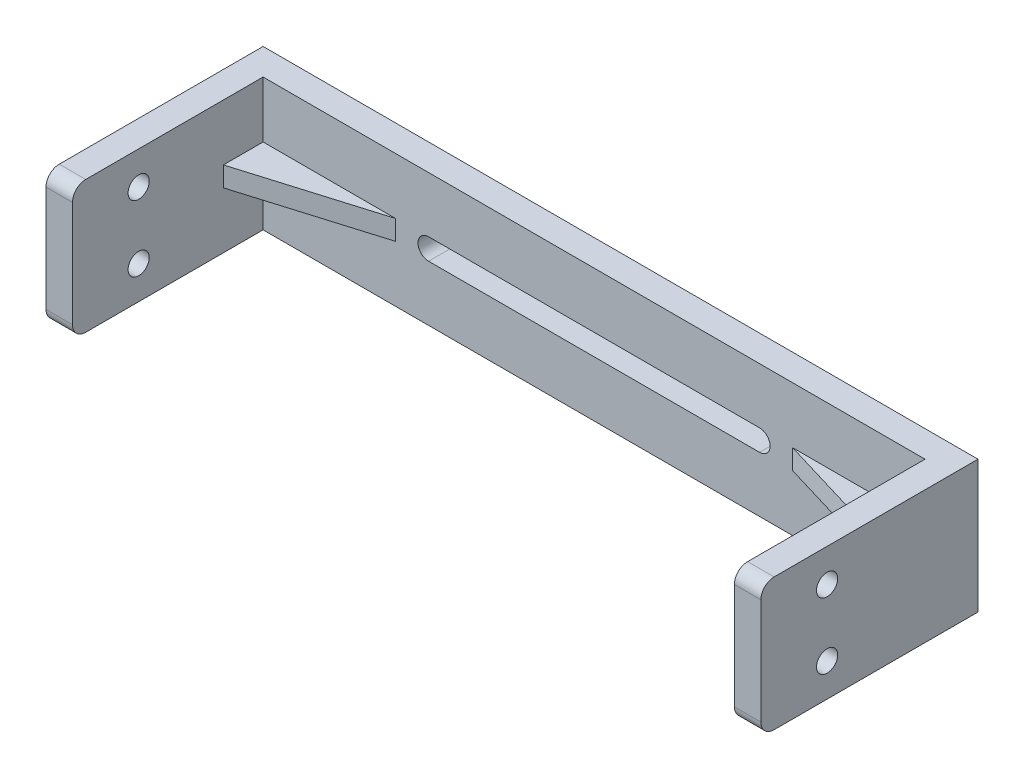
ISO-10303-21;
HEADER;
FILE_DESCRIPTION(('STEP AP214'),'2;1');
FILE_NAME('part.step','',(''),(''),'','','');
FILE_SCHEMA(('AUTOMOTIVE_DESIGN { 1 0 10303 214 1 1 1 1 }'));
ENDSEC;
DATA;
#1=APPLICATION_CONTEXT('core data for automotive mechanical design processes');
#2=APPLICATION_PROTOCOL_DEFINITION('international standard','automotive_design',2000,#1);
#3=PRODUCT_CONTEXT('',#1,'mechanical');
#4=PRODUCT('Part','Part','',(#3));
#5=PRODUCT_RELATED_PRODUCT_CATEGORY('part','',(#4));
#6=PRODUCT_DEFINITION_FORMATION('','',#4);
#7=PRODUCT_DEFINITION_CONTEXT('part definition',#1,'design');
#8=PRODUCT_DEFINITION('design','',#6,#7);
#9=PRODUCT_DEFINITION_SHAPE('','',#8);
#10=(LENGTH_UNIT() NAMED_UNIT(*) SI_UNIT(.MILLI.,.METRE.));
#11=(NAMED_UNIT(*) PLANE_ANGLE_UNIT() SI_UNIT($,.RADIAN.));
#12=(NAMED_UNIT(*) SI_UNIT($,.STERADIAN.) SOLID_ANGLE_UNIT());
#13=UNCERTAINTY_MEASURE_WITH_UNIT(LENGTH_MEASURE(1.E-05),#10,'distance_accuracy_value','');
#14=(GEOMETRIC_REPRESENTATION_CONTEXT(3) GLOBAL_UNCERTAINTY_ASSIGNED_CONTEXT((#13)) GLOBAL_UNIT_ASSIGNED_CONTEXT((#10,
#11,#12)) REPRESENTATION_CONTEXT('',''));
#15=CARTESIAN_POINT('',(0.,0.,0.));
#16=DIRECTION('',(0.,0.,1.));
#17=DIRECTION('',(1.,0.,0.));
#18=AXIS2_PLACEMENT_3D('',#15,#16,#17);
#19=CARTESIAN_POINT('',(-60.002,64.0000000000004,-114.3));
#20=DIRECTION('',(0.,0.,-1.));
#21=DIRECTION('',(-1.,0.,0.));
#22=AXIS2_PLACEMENT_3D('',#19,#20,#21);
#23=PLANE('',#22);
#24=DIRECTION('',(1.,0.,0.));
#25=VECTOR('',#24,1.);
#26=CARTESIAN_POINT('',(40.,52.4000000000004,-114.3));
#27=LINE('',#26,#25);
#28=CARTESIAN_POINT('',(-10.,52.4000000000004,-114.3));
#29=VERTEX_POINT('',#28);
#30=CARTESIAN_POINT('',(40.,52.4000000000004,-114.3));
#31=VERTEX_POINT('',#30);
#32=EDGE_CURVE('E293',#29,#31,#27,.T.);
#33=ORIENTED_EDGE('',*,*,#32,.F.);
#34=CARTESIAN_POINT('',(-10.,54.0000000000004,-114.3));
#35=DIRECTION('',(0.,0.,-1.));
#36=DIRECTION('',(-1.,0.,0.));
#37=AXIS2_PLACEMENT_3D('',#34,#35,#36);
#38=CIRCLE('',#37,1.60000000000001);
#39=CARTESIAN_POINT('',(-10.,55.6000000000005,-114.3));
#40=VERTEX_POINT('',#39);
#41=EDGE_CURVE('E296',#40,#29,#38,.F.);
#42=ORIENTED_EDGE('',*,*,#41,.F.);
#43=DIRECTION('',(-1.,0.,0.));
#44=VECTOR('',#43,1.);
#45=CARTESIAN_POINT('',(-9.99999999999999,55.6000000000005,-114.3));
#46=LINE('',#45,#44);
#47=CARTESIAN_POINT('',(40.,55.6000000000005,-114.3));
#48=VERTEX_POINT('',#47);
#49=EDGE_CURVE('E218',#48,#40,#46,.T.);
#50=ORIENTED_EDGE('',*,*,#49,.F.);
#51=CARTESIAN_POINT('',(40.,54.0000000000004,-114.3));
#52=DIRECTION('',(0.,0.,-1.));
#53=DIRECTION('',(-1.,0.,0.));
#54=AXIS2_PLACEMENT_3D('',#51,#52,#53);
#55=CIRCLE('',#54,1.60000000000002);
#56=EDGE_CURVE('E290',#31,#48,#55,.F.);
#57=ORIENTED_EDGE('',*,*,#56,.F.);
#58=EDGE_LOOP('',(#33,#42,#50,#57));
#59=FACE_BOUND('',#58,.T.);
#60=DIRECTION('',(1.,0.,0.));
#61=VECTOR('',#60,1.);
#62=CARTESIAN_POINT('',(45.,55.5000000000004,-114.3));
#63=LINE('',#62,#61);
#64=CARTESIAN_POINT('',(45.,55.5000000000004,-114.3));
#65=VERTEX_POINT('',#64);
#66=CARTESIAN_POINT('',(65.,55.5000000000004,-114.3));
#67=VERTEX_POINT('',#66);
#68=EDGE_CURVE('E193',#65,#67,#63,.T.);
#69=ORIENTED_EDGE('',*,*,#68,.T.);
#70=DIRECTION('',(0.,1.,0.));
#71=VECTOR('',#70,1.);
#72=CARTESIAN_POINT('',(65.,64.0000000000004,-114.3));
#73=LINE('',#72,#71);
#74=CARTESIAN_POINT('',(65.,64.0000000000004,-114.3));
#75=VERTEX_POINT('',#74);
#76=EDGE_CURVE('E204',#67,#75,#73,.T.);
#77=ORIENTED_EDGE('',*,*,#76,.T.);
#78=DIRECTION('',(1.,0.,0.));
#79=VECTOR('',#78,1.);
#80=CARTESIAN_POINT('',(-60.002,64.0000000000004,-114.3));
#81=LINE('',#80,#79);
#82=CARTESIAN_POINT('',(-35.,64.0000000000004,-114.3));
#83=VERTEX_POINT('',#82);
#84=EDGE_CURVE('E262',#83,#75,#81,.T.);
#85=ORIENTED_EDGE('',*,*,#84,.F.);
#86=DIRECTION('',(0.,1.,0.));
#87=VECTOR('',#86,1.);
#88=CARTESIAN_POINT('',(-35.,64.0000000000004,-114.3));
#89=LINE('',#88,#87);
#90=CARTESIAN_POINT('',(-35.,55.5000000000004,-114.3));
#91=VERTEX_POINT('',#90);
#92=EDGE_CURVE('E309',#91,#83,#89,.T.);
#93=ORIENTED_EDGE('',*,*,#92,.F.);
#94=DIRECTION('',(-1.,0.,0.));
#95=VECTOR('',#94,1.);
#96=CARTESIAN_POINT('',(-15.,55.5000000000004,-114.3));
#97=LINE('',#96,#95);
#98=CARTESIAN_POINT('',(-15.,55.5000000000004,-114.3));
#99=VERTEX_POINT('',#98);
#100=EDGE_CURVE('E322',#99,#91,#97,.T.);
#101=ORIENTED_EDGE('',*,*,#100,.F.);
#102=DIRECTION('',(0.,-1.,0.));
#103=VECTOR('',#102,1.);
#104=CARTESIAN_POINT('',(-15.,55.5000000000004,-114.3));
#105=LINE('',#104,#103);
#106=CARTESIAN_POINT('',(-15.,52.5000000000004,-114.3));
#107=VERTEX_POINT('',#106);
#108=EDGE_CURVE('E338',#99,#107,#105,.T.);
#109=ORIENTED_EDGE('',*,*,#108,.T.);
#110=DIRECTION('',(-1.,0.,0.));
#111=VECTOR('',#110,1.);
#112=CARTESIAN_POINT('',(-15.,52.5000000000004,-114.3));
#113=LINE('',#112,#111);
#114=CARTESIAN_POINT('',(-35.,52.5000000000004,-114.3));
#115=VERTEX_POINT('',#114);
#116=EDGE_CURVE('E328',#107,#115,#113,.T.);
#117=ORIENTED_EDGE('',*,*,#116,.T.);
#118=CARTESIAN_POINT('',(-35.,44.0000000000004,-114.3));
#119=VERTEX_POINT('',#118);
#120=EDGE_CURVE('E314',#119,#115,#89,.T.);
#121=ORIENTED_EDGE('',*,*,#120,.F.);
#122=DIRECTION('',(1.,0.,0.));
#123=VECTOR('',#122,1.);
#124=CARTESIAN_POINT('',(-60.002,44.0000000000004,-114.3));
#125=LINE('',#124,#123);
#126=CARTESIAN_POINT('',(65.,44.0000000000004,-114.3));
#127=VERTEX_POINT('',#126);
#128=EDGE_CURVE('E213',#119,#127,#125,.T.);
#129=ORIENTED_EDGE('',*,*,#128,.T.);
#130=CARTESIAN_POINT('',(65.,52.5000000000004,-114.3));
#131=VERTEX_POINT('',#130);
#132=EDGE_CURVE('E212',#127,#131,#73,.T.);
#133=ORIENTED_EDGE('',*,*,#132,.T.);
#134=DIRECTION('',(1.,0.,0.));
#135=VECTOR('',#134,1.);
#136=CARTESIAN_POINT('',(45.,52.5000000000004,-114.3));
#137=LINE('',#136,#135);
#138=CARTESIAN_POINT('',(45.,52.5000000000004,-114.3));
#139=VERTEX_POINT('',#138);
#140=EDGE_CURVE('E56',#139,#131,#137,.T.);
#141=ORIENTED_EDGE('',*,*,#140,.F.);
#142=DIRECTION('',(0.,-1.,0.));
#143=VECTOR('',#142,1.);
#144=CARTESIAN_POINT('',(45.,55.5000000000004,-114.3));
#145=LINE('',#144,#143);
#146=EDGE_CURVE('E206',#65,#139,#145,.T.);
#147=ORIENTED_EDGE('',*,*,#146,.F.);
#148=EDGE_LOOP('',(#69,#77,#85,#93,#101,#109,#117,#121,#129,#133,#141,#147));
#149=FACE_BOUND('',#148,.T.);
#150=ADVANCED_FACE('F41',(#59,#149),#23,.F.);
#151=CARTESIAN_POINT('',(65.,0.,0.));
#152=DIRECTION('',(1.,0.,0.));
#153=DIRECTION('',(0.,0.,1.));
#154=AXIS2_PLACEMENT_3D('',#151,#152,#153);
#155=PLANE('',#154);
#156=CARTESIAN_POINT('',(65.,59.0000000000004,-95.5));
#157=DIRECTION('',(1.,0.,0.));
#158=DIRECTION('',(0.,0.,-1.));
#159=AXIS2_PLACEMENT_3D('',#156,#157,#158);
#160=CIRCLE('',#159,1.59999999999998);
#161=CARTESIAN_POINT('',(65.,59.0000000000004,-97.1));
#162=VERTEX_POINT('',#161);
#163=EDGE_CURVE('E280',#162,#162,#160,.T.);
#164=ORIENTED_EDGE('',*,*,#163,.T.);
#165=EDGE_LOOP('',(#164));
#166=FACE_BOUND('',#165,.T.);
#167=CARTESIAN_POINT('',(65.,49.0000000000004,-95.5));
#168=DIRECTION('',(1.,0.,0.));
#169=DIRECTION('',(0.,0.,-1.));
#170=AXIS2_PLACEMENT_3D('',#167,#168,#169);
#171=CIRCLE('',#170,1.60000000000001);
#172=CARTESIAN_POINT('',(65.,49.0000000000004,-97.1));
#173=VERTEX_POINT('',#172);
#174=EDGE_CURVE('E286',#173,#173,#171,.T.);
#175=ORIENTED_EDGE('',*,*,#174,.T.);
#176=EDGE_LOOP('',(#175));
#177=FACE_BOUND('',#176,.T.);
#178=DIRECTION('',(0.,0.,1.));
#179=VECTOR('',#178,1.);
#180=CARTESIAN_POINT('',(65.,55.5000000000004,-114.3));
#181=LINE('',#180,#179);
#182=CARTESIAN_POINT('',(65.,55.5000000000004,-108.3));
#183=VERTEX_POINT('',#182);
#184=EDGE_CURVE('E190',#67,#183,#181,.T.);
#185=ORIENTED_EDGE('',*,*,#184,.T.);
#186=DIRECTION('',(0.,-1.,0.));
#187=VECTOR('',#186,1.);
#188=CARTESIAN_POINT('',(65.,55.5000000000004,-108.3));
#189=LINE('',#188,#187);
#190=CARTESIAN_POINT('',(65.,52.5000000000004,-108.3));
#191=VERTEX_POINT('',#190);
#192=EDGE_CURVE('E489',#183,#191,#189,.T.);
#193=ORIENTED_EDGE('',*,*,#192,.T.);
#194=DIRECTION('',(0.,0.,1.));
#195=VECTOR('',#194,1.);
#196=CARTESIAN_POINT('',(65.,52.5000000000004,-114.3));
#197=LINE('',#196,#195);
#198=EDGE_CURVE('E488',#131,#191,#197,.T.);
#199=ORIENTED_EDGE('',*,*,#198,.F.);
#200=ORIENTED_EDGE('',*,*,#132,.F.);
#201=DIRECTION('',(0.,0.,1.));
#202=VECTOR('',#201,1.);
#203=CARTESIAN_POINT('',(65.,44.0000000000004,-85.5));
#204=LINE('',#203,#202);
#205=CARTESIAN_POINT('',(65.,44.0000000000004,-87.5));
#206=VERTEX_POINT('',#205);
#207=EDGE_CURVE('E261',#127,#206,#204,.T.);
#208=ORIENTED_EDGE('',*,*,#207,.T.);
#209=CARTESIAN_POINT('',(65.,46.0000000000004,-87.5));
#210=DIRECTION('',(1.,0.,0.));
#211=DIRECTION('',(0.,0.,-1.));
#212=AXIS2_PLACEMENT_3D('',#209,#210,#211);
#213=CIRCLE('',#212,2.);
#214=CARTESIAN_POINT('',(65.,46.0000000000004,-85.5));
#215=VERTEX_POINT('',#214);
#216=EDGE_CURVE('E228',#206,#215,#213,.F.);
#217=ORIENTED_EDGE('',*,*,#216,.T.);
#218=DIRECTION('',(0.,1.,0.));
#219=VECTOR('',#218,1.);
#220=CARTESIAN_POINT('',(65.,44.0000000000004,-85.5));
#221=LINE('',#220,#219);
#222=CARTESIAN_POINT('',(65.,62.0000000000004,-85.5));
#223=VERTEX_POINT('',#222);
#224=EDGE_CURVE('E225',#215,#223,#221,.T.);
#225=ORIENTED_EDGE('',*,*,#224,.T.);
#226=CARTESIAN_POINT('',(65.,62.0000000000004,-87.5));
#227=DIRECTION('',(1.,0.,0.));
#228=DIRECTION('',(0.,0.,-1.));
#229=AXIS2_PLACEMENT_3D('',#226,#227,#228);
#230=CIRCLE('',#229,2.);
#231=CARTESIAN_POINT('',(65.,64.0000000000004,-87.5));
#232=VERTEX_POINT('',#231);
#233=EDGE_CURVE('E230',#223,#232,#230,.F.);
#234=ORIENTED_EDGE('',*,*,#233,.T.);
#235=DIRECTION('',(0.,0.,-1.));
#236=VECTOR('',#235,1.);
#237=CARTESIAN_POINT('',(65.,64.0000000000004,-85.5));
#238=LINE('',#237,#236);
#239=EDGE_CURVE('E210',#232,#75,#238,.T.);
#240=ORIENTED_EDGE('',*,*,#239,.T.);
#241=ORIENTED_EDGE('',*,*,#76,.F.);
#242=EDGE_LOOP('',(#185,#193,#199,#200,#208,#217,#225,#234,#240,#241));
#243=FACE_BOUND('',#242,.T.);
#244=ADVANCED_FACE('F208',(#166,#177,#243),#155,.F.);
#245=CARTESIAN_POINT('',(-35.,0.,0.));
#246=DIRECTION('',(-1.,0.,0.));
#247=DIRECTION('',(0.,0.,1.));
#248=AXIS2_PLACEMENT_3D('',#245,#246,#247);
#249=PLANE('',#248);
#250=CARTESIAN_POINT('',(-35.,59.0000000000004,-95.5));
#251=DIRECTION('',(-1.,0.,0.));
#252=DIRECTION('',(0.,0.,1.));
#253=AXIS2_PLACEMENT_3D('',#250,#251,#252);
#254=CIRCLE('',#253,1.59999999999998);
#255=CARTESIAN_POINT('',(-35.,59.0000000000004,-93.9));
#256=VERTEX_POINT('',#255);
#257=EDGE_CURVE('E272',#256,#256,#254,.T.);
#258=ORIENTED_EDGE('',*,*,#257,.T.);
#259=EDGE_LOOP('',(#258));
#260=FACE_BOUND('',#259,.T.);
#261=CARTESIAN_POINT('',(-35.,49.0000000000004,-95.5));
#262=DIRECTION('',(-1.,0.,0.));
#263=DIRECTION('',(0.,0.,1.));
#264=AXIS2_PLACEMENT_3D('',#261,#262,#263);
#265=CIRCLE('',#264,1.60000000000001);
#266=CARTESIAN_POINT('',(-35.,49.0000000000004,-93.9));
#267=VERTEX_POINT('',#266);
#268=EDGE_CURVE('E283',#267,#267,#265,.T.);
#269=ORIENTED_EDGE('',*,*,#268,.T.);
#270=EDGE_LOOP('',(#269));
#271=FACE_BOUND('',#270,.T.);
#272=DIRECTION('',(0.,0.,1.));
#273=VECTOR('',#272,1.);
#274=CARTESIAN_POINT('',(-35.,55.5000000000004,-114.3));
#275=LINE('',#274,#273);
#276=CARTESIAN_POINT('',(-35.,55.5000000000004,-108.3));
#277=VERTEX_POINT('',#276);
#278=EDGE_CURVE('E324',#91,#277,#275,.T.);
#279=ORIENTED_EDGE('',*,*,#278,.F.);
#280=ORIENTED_EDGE('',*,*,#92,.T.);
#281=DIRECTION('',(0.,0.,-1.));
#282=VECTOR('',#281,1.);
#283=CARTESIAN_POINT('',(-35.,64.0000000000004,-85.5));
#284=LINE('',#283,#282);
#285=CARTESIAN_POINT('',(-35.,64.0000000000004,-87.5));
#286=VERTEX_POINT('',#285);
#287=EDGE_CURVE('E254',#286,#83,#284,.T.);
#288=ORIENTED_EDGE('',*,*,#287,.F.);
#289=CARTESIAN_POINT('',(-35.,62.0000000000004,-87.5));
#290=DIRECTION('',(-1.,0.,0.));
#291=DIRECTION('',(0.,0.,1.));
#292=AXIS2_PLACEMENT_3D('',#289,#290,#291);
#293=CIRCLE('',#292,2.);
#294=CARTESIAN_POINT('',(-35.,62.0000000000004,-85.5));
#295=VERTEX_POINT('',#294);
#296=EDGE_CURVE('E49',#286,#295,#293,.F.);
#297=ORIENTED_EDGE('',*,*,#296,.T.);
#298=DIRECTION('',(0.,1.,0.));
#299=VECTOR('',#298,1.);
#300=CARTESIAN_POINT('',(-35.,44.0000000000004,-85.5));
#301=LINE('',#300,#299);
#302=CARTESIAN_POINT('',(-35.,46.0000000000004,-85.5));
#303=VERTEX_POINT('',#302);
#304=EDGE_CURVE('E252',#303,#295,#301,.T.);
#305=ORIENTED_EDGE('',*,*,#304,.F.);
#306=CARTESIAN_POINT('',(-35.,46.0000000000004,-87.5));
#307=DIRECTION('',(-1.,0.,0.));
#308=DIRECTION('',(0.,0.,1.));
#309=AXIS2_PLACEMENT_3D('',#306,#307,#308);
#310=CIRCLE('',#309,2.);
#311=CARTESIAN_POINT('',(-35.,44.0000000000004,-87.5));
#312=VERTEX_POINT('',#311);
#313=EDGE_CURVE('E11',#303,#312,#310,.F.);
#314=ORIENTED_EDGE('',*,*,#313,.T.);
#315=DIRECTION('',(0.,0.,1.));
#316=VECTOR('',#315,1.);
#317=CARTESIAN_POINT('',(-35.,44.0000000000004,-85.5));
#318=LINE('',#317,#316);
#319=EDGE_CURVE('E216',#119,#312,#318,.T.);
#320=ORIENTED_EDGE('',*,*,#319,.F.);
#321=ORIENTED_EDGE('',*,*,#120,.T.);
#322=DIRECTION('',(0.,0.,1.));
#323=VECTOR('',#322,1.);
#324=CARTESIAN_POINT('',(-35.,52.5000000000004,-114.3));
#325=LINE('',#324,#323);
#326=CARTESIAN_POINT('',(-35.,52.5000000000004,-108.3));
#327=VERTEX_POINT('',#326);
#328=EDGE_CURVE('E339',#115,#327,#325,.T.);
#329=ORIENTED_EDGE('',*,*,#328,.T.);
#330=DIRECTION('',(0.,-1.,0.));
#331=VECTOR('',#330,1.);
#332=CARTESIAN_POINT('',(-35.,55.5000000000004,-108.3));
#333=LINE('',#332,#331);
#334=EDGE_CURVE('E64',#277,#327,#333,.T.);
#335=ORIENTED_EDGE('',*,*,#334,.F.);
#336=EDGE_LOOP('',(#279,#280,#288,#297,#305,#314,#320,#321,#329,#335));
#337=FACE_BOUND('',#336,.T.);
#338=ADVANCED_FACE('F251',(#260,#271,#337),#249,.F.);
#339=CARTESIAN_POINT('',(66.5,44.0000000000004,-85.5));
#340=DIRECTION('',(0.,0.,1.));
#341=DIRECTION('',(1.,0.,0.));
#342=AXIS2_PLACEMENT_3D('',#339,#340,#341);
#343=PLANE('',#342);
#344=DIRECTION('',(-1.,0.,0.));
#345=VECTOR('',#344,1.);
#346=CARTESIAN_POINT('',(66.5,46.0000000000004,-85.5));
#347=LINE('',#346,#345);
#348=CARTESIAN_POINT('',(69.,46.0000000000004,-85.5));
#349=VERTEX_POINT('',#348);
#350=EDGE_CURVE('E222',#215,#349,#347,.F.);
#351=ORIENTED_EDGE('',*,*,#350,.T.);
#352=DIRECTION('',(0.,-1.,0.));
#353=VECTOR('',#352,1.);
#354=CARTESIAN_POINT('',(69.,62.0000000000004,-85.5));
#355=LINE('',#354,#353);
#356=CARTESIAN_POINT('',(69.,62.0000000000004,-85.5));
#357=VERTEX_POINT('',#356);
#358=EDGE_CURVE('E380',#357,#349,#355,.T.);
#359=ORIENTED_EDGE('',*,*,#358,.F.);
#360=DIRECTION('',(-1.,0.,0.));
#361=VECTOR('',#360,1.);
#362=CARTESIAN_POINT('',(65.,62.0000000000004,-85.5));
#363=LINE('',#362,#361);
#364=EDGE_CURVE('E224',#357,#223,#363,.T.);
#365=ORIENTED_EDGE('',*,*,#364,.T.);
#366=ORIENTED_EDGE('',*,*,#224,.F.);
#367=EDGE_LOOP('',(#351,#359,#365,#366));
#368=FACE_BOUND('',#367,.T.);
#369=ADVANCED_FACE('F471',(#368),#343,.T.);
#370=CARTESIAN_POINT('',(-36.5,44.0000000000004,-85.5));
#371=DIRECTION('',(0.,1.,0.));
#372=DIRECTION('',(-1.,0.,0.));
#373=AXIS2_PLACEMENT_3D('',#370,#371,#372);
#374=PLANE('',#373);
#375=DIRECTION('',(0.,0.,1.));
#376=VECTOR('',#375,1.);
#377=CARTESIAN_POINT('',(-39.,44.0000000000004,-115.5));
#378=LINE('',#377,#376);
#379=CARTESIAN_POINT('',(-39.,44.0000000000004,-118.3));
#380=VERTEX_POINT('',#379);
#381=CARTESIAN_POINT('',(-39.,44.0000000000004,-87.5));
#382=VERTEX_POINT('',#381);
#383=EDGE_CURVE('E394',#380,#382,#378,.T.);
#384=ORIENTED_EDGE('',*,*,#383,.F.);
#385=DIRECTION('',(-1.,0.,0.));
#386=VECTOR('',#385,1.);
#387=CARTESIAN_POINT('',(69.,44.0000000000004,-118.3));
#388=LINE('',#387,#386);
#389=CARTESIAN_POINT('',(69.,44.0000000000004,-118.3));
#390=VERTEX_POINT('',#389);
#391=EDGE_CURVE('E365',#390,#380,#388,.T.);
#392=ORIENTED_EDGE('',*,*,#391,.F.);
#393=DIRECTION('',(0.,0.,-1.));
#394=VECTOR('',#393,1.);
#395=CARTESIAN_POINT('',(69.,44.0000000000004,-87.5));
#396=LINE('',#395,#394);
#397=CARTESIAN_POINT('',(69.,44.0000000000004,-87.5));
#398=VERTEX_POINT('',#397);
#399=EDGE_CURVE('E386',#398,#390,#396,.T.);
#400=ORIENTED_EDGE('',*,*,#399,.F.);
#401=DIRECTION('',(-1.,0.,0.));
#402=VECTOR('',#401,1.);
#403=CARTESIAN_POINT('',(65.,44.0000000000004,-87.5));
#404=LINE('',#403,#402);
#405=EDGE_CURVE('E239',#398,#206,#404,.T.);
#406=ORIENTED_EDGE('',*,*,#405,.T.);
#407=ORIENTED_EDGE('',*,*,#207,.F.);
#408=ORIENTED_EDGE('',*,*,#128,.F.);
#409=ORIENTED_EDGE('',*,*,#319,.T.);
#410=DIRECTION('',(1.,0.,0.));
#411=VECTOR('',#410,1.);
#412=CARTESIAN_POINT('',(-36.5,44.0000000000004,-87.5));
#413=LINE('',#412,#411);
#414=EDGE_CURVE('E237',#312,#382,#413,.F.);
#415=ORIENTED_EDGE('',*,*,#414,.T.);
#416=EDGE_LOOP('',(#384,#392,#400,#406,#407,#408,#409,#415));
#417=FACE_BOUND('',#416,.T.);
#418=ADVANCED_FACE('F407',(#417),#374,.F.);
#419=CARTESIAN_POINT('',(-36.5,64.0000000000004,-85.5));
#420=DIRECTION('',(0.,-1.,0.));
#421=DIRECTION('',(1.,0.,0.));
#422=AXIS2_PLACEMENT_3D('',#419,#420,#421);
#423=PLANE('',#422);
#424=ORIENTED_EDGE('',*,*,#239,.F.);
#425=DIRECTION('',(-1.,0.,0.));
#426=VECTOR('',#425,1.);
#427=CARTESIAN_POINT('',(66.5,64.0000000000004,-87.5));
#428=LINE('',#427,#426);
#429=CARTESIAN_POINT('',(69.,64.0000000000004,-87.5));
#430=VERTEX_POINT('',#429);
#431=EDGE_CURVE('E235',#232,#430,#428,.F.);
#432=ORIENTED_EDGE('',*,*,#431,.T.);
#433=DIRECTION('',(0.,0.,1.));
#434=VECTOR('',#433,1.);
#435=CARTESIAN_POINT('',(69.,64.0000000000004,-115.5));
#436=LINE('',#435,#434);
#437=CARTESIAN_POINT('',(69.,64.0000000000004,-118.3));
#438=VERTEX_POINT('',#437);
#439=EDGE_CURVE('E374',#438,#430,#436,.T.);
#440=ORIENTED_EDGE('',*,*,#439,.F.);
#441=DIRECTION('',(1.,0.,0.));
#442=VECTOR('',#441,1.);
#443=CARTESIAN_POINT('',(-39.,64.0000000000004,-118.3));
#444=LINE('',#443,#442);
#445=CARTESIAN_POINT('',(-39.,64.0000000000004,-118.3));
#446=VERTEX_POINT('',#445);
#447=EDGE_CURVE('E359',#446,#438,#444,.T.);
#448=ORIENTED_EDGE('',*,*,#447,.F.);
#449=DIRECTION('',(0.,0.,-1.));
#450=VECTOR('',#449,1.);
#451=CARTESIAN_POINT('',(-39.,64.0000000000004,-87.5));
#452=LINE('',#451,#450);
#453=CARTESIAN_POINT('',(-39.,64.0000000000004,-87.5));
#454=VERTEX_POINT('',#453);
#455=EDGE_CURVE('E269',#454,#446,#452,.T.);
#456=ORIENTED_EDGE('',*,*,#455,.F.);
#457=DIRECTION('',(1.,0.,0.));
#458=VECTOR('',#457,1.);
#459=CARTESIAN_POINT('',(-36.5,64.0000000000004,-87.5));
#460=LINE('',#459,#458);
#461=EDGE_CURVE('E232',#454,#286,#460,.T.);
#462=ORIENTED_EDGE('',*,*,#461,.T.);
#463=ORIENTED_EDGE('',*,*,#287,.T.);
#464=ORIENTED_EDGE('',*,*,#84,.T.);
#465=EDGE_LOOP('',(#424,#432,#440,#448,#456,#462,#463,#464));
#466=FACE_BOUND('',#465,.T.);
#467=ADVANCED_FACE('F317',(#466),#423,.F.);
#468=CARTESIAN_POINT('',(-36.5,44.0000000000004,-85.5));
#469=DIRECTION('',(0.,0.,-1.));
#470=DIRECTION('',(-1.,0.,0.));
#471=AXIS2_PLACEMENT_3D('',#468,#469,#470);
#472=PLANE('',#471);
#473=DIRECTION('',(1.,0.,0.));
#474=VECTOR('',#473,1.);
#475=CARTESIAN_POINT('',(-36.5,62.0000000000004,-85.5));
#476=LINE('',#475,#474);
#477=CARTESIAN_POINT('',(-39.,62.0000000000004,-85.5));
#478=VERTEX_POINT('',#477);
#479=EDGE_CURVE('E242',#295,#478,#476,.F.);
#480=ORIENTED_EDGE('',*,*,#479,.T.);
#481=DIRECTION('',(0.,1.,0.));
#482=VECTOR('',#481,1.);
#483=CARTESIAN_POINT('',(-39.,46.0000000000004,-85.5));
#484=LINE('',#483,#482);
#485=CARTESIAN_POINT('',(-39.,46.0000000000004,-85.5));
#486=VERTEX_POINT('',#485);
#487=EDGE_CURVE('E270',#486,#478,#484,.T.);
#488=ORIENTED_EDGE('',*,*,#487,.F.);
#489=DIRECTION('',(1.,0.,0.));
#490=VECTOR('',#489,1.);
#491=CARTESIAN_POINT('',(-36.5,46.0000000000004,-85.5));
#492=LINE('',#491,#490);
#493=EDGE_CURVE('E244',#486,#303,#492,.T.);
#494=ORIENTED_EDGE('',*,*,#493,.T.);
#495=ORIENTED_EDGE('',*,*,#304,.T.);
#496=EDGE_LOOP('',(#480,#488,#494,#495));
#497=FACE_BOUND('',#496,.T.);
#498=ADVANCED_FACE('F258',(#497),#472,.F.);
#499=CARTESIAN_POINT('',(66.5,62.0000000000004,-87.5));
#500=DIRECTION('',(1.,0.,0.));
#501=DIRECTION('',(0.,1.,0.));
#502=AXIS2_PLACEMENT_3D('',#499,#500,#501);
#503=CYLINDRICAL_SURFACE('',#502,2.);
#504=ORIENTED_EDGE('',*,*,#364,.F.);
#505=CARTESIAN_POINT('',(69.,62.0000000000004,-87.5));
#506=DIRECTION('',(1.,0.,0.));
#507=DIRECTION('',(0.,0.,-1.));
#508=AXIS2_PLACEMENT_3D('',#505,#506,#507);
#509=CIRCLE('',#508,2.);
#510=EDGE_CURVE('E377',#430,#357,#509,.T.);
#511=ORIENTED_EDGE('',*,*,#510,.F.);
#512=ORIENTED_EDGE('',*,*,#431,.F.);
#513=ORIENTED_EDGE('',*,*,#233,.F.);
#514=EDGE_LOOP('',(#504,#511,#512,#513));
#515=FACE_BOUND('',#514,.T.);
#516=ADVANCED_FACE('F437',(#515),#503,.T.);
#517=CARTESIAN_POINT('',(-36.5,46.0000000000004,-87.5));
#518=DIRECTION('',(1.,0.,0.));
#519=DIRECTION('',(0.,1.,0.));
#520=AXIS2_PLACEMENT_3D('',#517,#518,#519);
#521=CYLINDRICAL_SURFACE('',#520,2.);
#522=ORIENTED_EDGE('',*,*,#405,.F.);
#523=CARTESIAN_POINT('',(69.,46.0000000000004,-87.5));
#524=DIRECTION('',(1.,0.,0.));
#525=DIRECTION('',(0.,0.,-1.));
#526=AXIS2_PLACEMENT_3D('',#523,#524,#525);
#527=CIRCLE('',#526,2.);
#528=EDGE_CURVE('E383',#349,#398,#527,.T.);
#529=ORIENTED_EDGE('',*,*,#528,.F.);
#530=ORIENTED_EDGE('',*,*,#350,.F.);
#531=ORIENTED_EDGE('',*,*,#216,.F.);
#532=EDGE_LOOP('',(#522,#529,#530,#531));
#533=FACE_BOUND('',#532,.T.);
#534=ADVANCED_FACE('F440',(#533),#521,.T.);
#535=CARTESIAN_POINT('',(-36.5,46.0000000000004,-87.5));
#536=DIRECTION('',(1.,0.,0.));
#537=DIRECTION('',(0.,1.,0.));
#538=AXIS2_PLACEMENT_3D('',#535,#536,#537);
#539=CYLINDRICAL_SURFACE('',#538,2.);
#540=ORIENTED_EDGE('',*,*,#493,.F.);
#541=CARTESIAN_POINT('',(-39.,46.0000000000004,-87.5));
#542=DIRECTION('',(-1.,0.,0.));
#543=DIRECTION('',(0.,0.,1.));
#544=AXIS2_PLACEMENT_3D('',#541,#542,#543);
#545=CIRCLE('',#544,2.);
#546=EDGE_CURVE('E274',#382,#486,#545,.T.);
#547=ORIENTED_EDGE('',*,*,#546,.F.);
#548=ORIENTED_EDGE('',*,*,#414,.F.);
#549=ORIENTED_EDGE('',*,*,#313,.F.);
#550=EDGE_LOOP('',(#540,#547,#548,#549));
#551=FACE_BOUND('',#550,.T.);
#552=ADVANCED_FACE('F403',(#551),#539,.T.);
#553=CARTESIAN_POINT('',(-36.5,62.0000000000004,-87.5));
#554=DIRECTION('',(1.,0.,0.));
#555=DIRECTION('',(0.,1.,0.));
#556=AXIS2_PLACEMENT_3D('',#553,#554,#555);
#557=CYLINDRICAL_SURFACE('',#556,2.);
#558=ORIENTED_EDGE('',*,*,#461,.F.);
#559=CARTESIAN_POINT('',(-39.,62.0000000000004,-87.5));
#560=DIRECTION('',(-1.,0.,0.));
#561=DIRECTION('',(0.,0.,1.));
#562=AXIS2_PLACEMENT_3D('',#559,#560,#561);
#563=CIRCLE('',#562,2.);
#564=EDGE_CURVE('E266',#478,#454,#563,.T.);
#565=ORIENTED_EDGE('',*,*,#564,.F.);
#566=ORIENTED_EDGE('',*,*,#479,.F.);
#567=ORIENTED_EDGE('',*,*,#296,.F.);
#568=EDGE_LOOP('',(#558,#565,#566,#567));
#569=FACE_BOUND('',#568,.T.);
#570=ADVANCED_FACE('F43',(#569),#557,.T.);
#571=CARTESIAN_POINT('',(-10.,54.0000000000004,-61.0038462926263));
#572=DIRECTION('',(0.,0.,-1.));
#573=DIRECTION('',(-1.,0.,0.));
#574=AXIS2_PLACEMENT_3D('',#571,#572,#573);
#575=CYLINDRICAL_SURFACE('',#574,1.60000000000001);
#576=ORIENTED_EDGE('',*,*,#41,.T.);
#577=DIRECTION('',(0.,0.,-1.));
#578=VECTOR('',#577,1.);
#579=CARTESIAN_POINT('',(-10.,52.4000000000004,-61.0038462926263));
#580=LINE('',#579,#578);
#581=CARTESIAN_POINT('',(-10.,52.4000000000004,-118.3));
#582=VERTEX_POINT('',#581);
#583=EDGE_CURVE('E294',#29,#582,#580,.T.);
#584=ORIENTED_EDGE('',*,*,#583,.T.);
#585=CARTESIAN_POINT('',(-10.,54.0000000000004,-118.3));
#586=DIRECTION('',(0.,0.,-1.));
#587=DIRECTION('',(-1.,0.,0.));
#588=AXIS2_PLACEMENT_3D('',#585,#586,#587);
#589=CIRCLE('',#588,1.60000000000001);
#590=CARTESIAN_POINT('',(-10.,55.6000000000005,-118.3));
#591=VERTEX_POINT('',#590);
#592=EDGE_CURVE('E350',#582,#591,#589,.T.);
#593=ORIENTED_EDGE('',*,*,#592,.T.);
#594=DIRECTION('',(0.,0.,-1.));
#595=VECTOR('',#594,1.);
#596=CARTESIAN_POINT('',(-10.,55.6000000000005,-61.0038462926263));
#597=LINE('',#596,#595);
#598=EDGE_CURVE('E289',#40,#591,#597,.T.);
#599=ORIENTED_EDGE('',*,*,#598,.F.);
#600=EDGE_LOOP('',(#576,#584,#593,#599));
#601=FACE_BOUND('',#600,.T.);
#602=ADVANCED_FACE('F448',(#601),#575,.F.);
#603=CARTESIAN_POINT('',(40.,52.4000000000004,-61.0038462926263));
#604=DIRECTION('',(0.,-1.,0.));
#605=DIRECTION('',(0.,0.,-1.));
#606=AXIS2_PLACEMENT_3D('',#603,#604,#605);
#607=PLANE('',#606);
#608=ORIENTED_EDGE('',*,*,#32,.T.);
#609=DIRECTION('',(0.,0.,-1.));
#610=VECTOR('',#609,1.);
#611=CARTESIAN_POINT('',(40.,52.4000000000004,-61.0038462926263));
#612=LINE('',#611,#610);
#613=CARTESIAN_POINT('',(40.,52.4000000000004,-118.3));
#614=VERTEX_POINT('',#613);
#615=EDGE_CURVE('E299',#31,#614,#612,.T.);
#616=ORIENTED_EDGE('',*,*,#615,.T.);
#617=DIRECTION('',(-1.,0.,0.));
#618=VECTOR('',#617,1.);
#619=CARTESIAN_POINT('',(40.,52.4000000000004,-118.3));
#620=LINE('',#619,#618);
#621=EDGE_CURVE('E347',#614,#582,#620,.T.);
#622=ORIENTED_EDGE('',*,*,#621,.T.);
#623=ORIENTED_EDGE('',*,*,#583,.F.);
#624=EDGE_LOOP('',(#608,#616,#622,#623));
#625=FACE_BOUND('',#624,.T.);
#626=ADVANCED_FACE('F452',(#625),#607,.F.);
#627=CARTESIAN_POINT('',(40.,54.0000000000004,-61.0038462926263));
#628=DIRECTION('',(0.,0.,-1.));
#629=DIRECTION('',(-1.,0.,0.));
#630=AXIS2_PLACEMENT_3D('',#627,#628,#629);
#631=CYLINDRICAL_SURFACE('',#630,1.60000000000002);
#632=ORIENTED_EDGE('',*,*,#56,.T.);
#633=DIRECTION('',(0.,0.,-1.));
#634=VECTOR('',#633,1.);
#635=CARTESIAN_POINT('',(40.,55.6000000000005,-61.0038462926263));
#636=LINE('',#635,#634);
#637=CARTESIAN_POINT('',(40.,55.6000000000005,-118.3));
#638=VERTEX_POINT('',#637);
#639=EDGE_CURVE('E301',#48,#638,#636,.T.);
#640=ORIENTED_EDGE('',*,*,#639,.T.);
#641=CARTESIAN_POINT('',(40.,54.0000000000004,-118.3));
#642=DIRECTION('',(0.,0.,-1.));
#643=DIRECTION('',(-1.,0.,0.));
#644=AXIS2_PLACEMENT_3D('',#641,#642,#643);
#645=CIRCLE('',#644,1.60000000000002);
#646=EDGE_CURVE('E344',#638,#614,#645,.T.);
#647=ORIENTED_EDGE('',*,*,#646,.T.);
#648=ORIENTED_EDGE('',*,*,#615,.F.);
#649=EDGE_LOOP('',(#632,#640,#647,#648));
#650=FACE_BOUND('',#649,.T.);
#651=ADVANCED_FACE('F458',(#650),#631,.F.);
#652=CARTESIAN_POINT('',(-10.,55.6000000000005,-61.0038462926263));
#653=DIRECTION('',(0.,1.,0.));
#654=DIRECTION('',(-1.,0.,0.));
#655=AXIS2_PLACEMENT_3D('',#652,#653,#654);
#656=PLANE('',#655);
#657=ORIENTED_EDGE('',*,*,#49,.T.);
#658=ORIENTED_EDGE('',*,*,#598,.T.);
#659=DIRECTION('',(1.,0.,0.));
#660=VECTOR('',#659,1.);
#661=CARTESIAN_POINT('',(-10.,55.6000000000005,-118.3));
#662=LINE('',#661,#660);
#663=EDGE_CURVE('E353',#591,#638,#662,.T.);
#664=ORIENTED_EDGE('',*,*,#663,.T.);
#665=ORIENTED_EDGE('',*,*,#639,.F.);
#666=EDGE_LOOP('',(#657,#658,#664,#665));
#667=FACE_BOUND('',#666,.T.);
#668=ADVANCED_FACE('F463',(#667),#656,.F.);
#669=CARTESIAN_POINT('',(66.5,59.0000000000004,-95.5));
#670=DIRECTION('',(-1.,0.,0.));
#671=DIRECTION('',(0.,0.,1.));
#672=AXIS2_PLACEMENT_3D('',#669,#670,#671);
#673=CYLINDRICAL_SURFACE('',#672,1.59999999999998);
#674=ORIENTED_EDGE('',*,*,#257,.F.);
#675=EDGE_LOOP('',(#674));
#676=FACE_BOUND('',#675,.T.);
#677=CARTESIAN_POINT('',(-39.,59.0000000000004,-95.5));
#678=DIRECTION('',(-1.,0.,0.));
#679=DIRECTION('',(0.,0.,1.));
#680=AXIS2_PLACEMENT_3D('',#677,#678,#679);
#681=CIRCLE('',#680,1.59999999999998);
#682=CARTESIAN_POINT('',(-39.,59.0000000000004,-93.9));
#683=VERTEX_POINT('',#682);
#684=EDGE_CURVE('E388',#683,#683,#681,.T.);
#685=ORIENTED_EDGE('',*,*,#684,.T.);
#686=EDGE_LOOP('',(#685));
#687=FACE_BOUND('',#686,.T.);
#688=ADVANCED_FACE('F617',(#676,#687),#673,.F.);
#689=CARTESIAN_POINT('',(66.5,49.0000000000004,-95.5));
#690=DIRECTION('',(-1.,0.,0.));
#691=DIRECTION('',(0.,0.,1.));
#692=AXIS2_PLACEMENT_3D('',#689,#690,#691);
#693=CYLINDRICAL_SURFACE('',#692,1.60000000000001);
#694=ORIENTED_EDGE('',*,*,#268,.F.);
#695=EDGE_LOOP('',(#694));
#696=FACE_BOUND('',#695,.T.);
#697=CARTESIAN_POINT('',(-39.,49.0000000000004,-95.5));
#698=DIRECTION('',(-1.,0.,0.));
#699=DIRECTION('',(0.,0.,1.));
#700=AXIS2_PLACEMENT_3D('',#697,#698,#699);
#701=CIRCLE('',#700,1.60000000000001);
#702=CARTESIAN_POINT('',(-39.,49.0000000000004,-93.9));
#703=VERTEX_POINT('',#702);
#704=EDGE_CURVE('E391',#703,#703,#701,.T.);
#705=ORIENTED_EDGE('',*,*,#704,.T.);
#706=EDGE_LOOP('',(#705));
#707=FACE_BOUND('',#706,.T.);
#708=ADVANCED_FACE('F607',(#696,#707),#693,.F.);
#709=ORIENTED_EDGE('',*,*,#163,.F.);
#710=EDGE_LOOP('',(#709));
#711=FACE_BOUND('',#710,.T.);
#712=CARTESIAN_POINT('',(69.,59.0000000000004,-95.5));
#713=DIRECTION('',(1.,0.,0.));
#714=DIRECTION('',(0.,0.,-1.));
#715=AXIS2_PLACEMENT_3D('',#712,#713,#714);
#716=CIRCLE('',#715,1.59999999999998);
#717=CARTESIAN_POINT('',(69.,59.0000000000004,-97.1));
#718=VERTEX_POINT('',#717);
#719=EDGE_CURVE('E371',#718,#718,#716,.T.);
#720=ORIENTED_EDGE('',*,*,#719,.T.);
#721=EDGE_LOOP('',(#720));
#722=FACE_BOUND('',#721,.T.);
#723=ADVANCED_FACE('F604',(#711,#722),#673,.F.);
#724=ORIENTED_EDGE('',*,*,#174,.F.);
#725=EDGE_LOOP('',(#724));
#726=FACE_BOUND('',#725,.T.);
#727=CARTESIAN_POINT('',(69.,49.0000000000004,-95.5));
#728=DIRECTION('',(1.,0.,0.));
#729=DIRECTION('',(0.,0.,-1.));
#730=AXIS2_PLACEMENT_3D('',#727,#728,#729);
#731=CIRCLE('',#730,1.60000000000001);
#732=CARTESIAN_POINT('',(69.,49.0000000000004,-97.1));
#733=VERTEX_POINT('',#732);
#734=EDGE_CURVE('E368',#733,#733,#731,.T.);
#735=ORIENTED_EDGE('',*,*,#734,.T.);
#736=EDGE_LOOP('',(#735));
#737=FACE_BOUND('',#736,.T.);
#738=ADVANCED_FACE('F592',(#726,#737),#693,.F.);
#739=CARTESIAN_POINT('',(-39.,46.0000000000004,-87.5));
#740=DIRECTION('',(-1.,0.,0.));
#741=DIRECTION('',(0.,0.,1.));
#742=AXIS2_PLACEMENT_3D('',#739,#740,#741);
#743=PLANE('',#742);
#744=ORIENTED_EDGE('',*,*,#704,.F.);
#745=EDGE_LOOP('',(#744));
#746=FACE_BOUND('',#745,.T.);
#747=ORIENTED_EDGE('',*,*,#455,.T.);
#748=DIRECTION('',(0.,1.,0.));
#749=VECTOR('',#748,1.);
#750=CARTESIAN_POINT('',(-39.,44.0000000000004,-118.3));
#751=LINE('',#750,#749);
#752=EDGE_CURVE('E356',#380,#446,#751,.T.);
#753=ORIENTED_EDGE('',*,*,#752,.F.);
#754=ORIENTED_EDGE('',*,*,#383,.T.);
#755=ORIENTED_EDGE('',*,*,#546,.T.);
#756=ORIENTED_EDGE('',*,*,#487,.T.);
#757=ORIENTED_EDGE('',*,*,#564,.T.);
#758=EDGE_LOOP('',(#747,#753,#754,#755,#756,#757));
#759=FACE_BOUND('',#758,.T.);
#760=ORIENTED_EDGE('',*,*,#684,.F.);
#761=EDGE_LOOP('',(#760));
#762=FACE_BOUND('',#761,.T.);
#763=ADVANCED_FACE('F398',(#746,#759,#762),#743,.T.);
#764=CARTESIAN_POINT('',(69.,62.0000000000004,-87.5));
#765=DIRECTION('',(1.,0.,0.));
#766=DIRECTION('',(0.,0.,-1.));
#767=AXIS2_PLACEMENT_3D('',#764,#765,#766);
#768=PLANE('',#767);
#769=ORIENTED_EDGE('',*,*,#719,.F.);
#770=EDGE_LOOP('',(#769));
#771=FACE_BOUND('',#770,.T.);
#772=ORIENTED_EDGE('',*,*,#399,.T.);
#773=DIRECTION('',(0.,-1.,0.));
#774=VECTOR('',#773,1.);
#775=CARTESIAN_POINT('',(69.,64.0000000000004,-118.3));
#776=LINE('',#775,#774);
#777=EDGE_CURVE('E362',#438,#390,#776,.T.);
#778=ORIENTED_EDGE('',*,*,#777,.F.);
#779=ORIENTED_EDGE('',*,*,#439,.T.);
#780=ORIENTED_EDGE('',*,*,#510,.T.);
#781=ORIENTED_EDGE('',*,*,#358,.T.);
#782=ORIENTED_EDGE('',*,*,#528,.T.);
#783=EDGE_LOOP('',(#772,#778,#779,#780,#781,#782));
#784=FACE_BOUND('',#783,.T.);
#785=ORIENTED_EDGE('',*,*,#734,.F.);
#786=EDGE_LOOP('',(#785));
#787=FACE_BOUND('',#786,.T.);
#788=ADVANCED_FACE('F483',(#771,#784,#787),#768,.T.);
#789=CARTESIAN_POINT('',(0.,0.,-118.3));
#790=DIRECTION('',(0.,0.,-1.));
#791=DIRECTION('',(-1.,0.,0.));
#792=AXIS2_PLACEMENT_3D('',#789,#790,#791);
#793=PLANE('',#792);
#794=ORIENTED_EDGE('',*,*,#752,.T.);
#795=ORIENTED_EDGE('',*,*,#447,.T.);
#796=ORIENTED_EDGE('',*,*,#777,.T.);
#797=ORIENTED_EDGE('',*,*,#391,.T.);
#798=EDGE_LOOP('',(#794,#795,#796,#797));
#799=FACE_BOUND('',#798,.T.);
#800=ORIENTED_EDGE('',*,*,#621,.F.);
#801=ORIENTED_EDGE('',*,*,#646,.F.);
#802=ORIENTED_EDGE('',*,*,#663,.F.);
#803=ORIENTED_EDGE('',*,*,#592,.F.);
#804=EDGE_LOOP('',(#800,#801,#802,#803));
#805=FACE_BOUND('',#804,.T.);
#806=ADVANCED_FACE('F423',(#799,#805),#793,.T.);
#807=CARTESIAN_POINT('',(-35.,55.5000000000004,-108.3));
#808=DIRECTION('',(-0.287347885566346,0.,-0.957826285221151));
#809=DIRECTION('',(-0.957826285221151,0.,0.287347885566346));
#810=AXIS2_PLACEMENT_3D('',#807,#808,#809);
#811=PLANE('',#810);
#812=DIRECTION('',(0.957826285221151,0.,-0.287347885566346));
#813=VECTOR('',#812,1.);
#814=CARTESIAN_POINT('',(-35.,52.5000000000004,-108.3));
#815=LINE('',#814,#813);
#816=EDGE_CURVE('E332',#327,#107,#815,.T.);
#817=ORIENTED_EDGE('',*,*,#816,.T.);
#818=ORIENTED_EDGE('',*,*,#108,.F.);
#819=DIRECTION('',(0.957826285221151,0.,-0.287347885566346));
#820=VECTOR('',#819,1.);
#821=CARTESIAN_POINT('',(-35.,55.5000000000004,-108.3));
#822=LINE('',#821,#820);
#823=EDGE_CURVE('E327',#277,#99,#822,.T.);
#824=ORIENTED_EDGE('',*,*,#823,.F.);
#825=ORIENTED_EDGE('',*,*,#334,.T.);
#826=EDGE_LOOP('',(#817,#818,#824,#825));
#827=FACE_BOUND('',#826,.T.);
#828=ADVANCED_FACE('F413',(#827),#811,.F.);
#829=CARTESIAN_POINT('',(0.,55.5000000000004,0.));
#830=DIRECTION('',(0.,-1.,0.));
#831=DIRECTION('',(0.,0.,-1.));
#832=AXIS2_PLACEMENT_3D('',#829,#830,#831);
#833=PLANE('',#832);
#834=ORIENTED_EDGE('',*,*,#278,.T.);
#835=ORIENTED_EDGE('',*,*,#823,.T.);
#836=ORIENTED_EDGE('',*,*,#100,.T.);
#837=EDGE_LOOP('',(#834,#835,#836));
#838=FACE_BOUND('',#837,.T.);
#839=ADVANCED_FACE('F414',(#838),#833,.F.);
#840=CARTESIAN_POINT('',(0.,52.5000000000004,0.));
#841=DIRECTION('',(0.,-1.,0.));
#842=DIRECTION('',(0.,0.,-1.));
#843=AXIS2_PLACEMENT_3D('',#840,#841,#842);
#844=PLANE('',#843);
#845=ORIENTED_EDGE('',*,*,#328,.F.);
#846=ORIENTED_EDGE('',*,*,#116,.F.);
#847=ORIENTED_EDGE('',*,*,#816,.F.);
#848=EDGE_LOOP('',(#845,#846,#847));
#849=FACE_BOUND('',#848,.T.);
#850=ADVANCED_FACE('F411',(#849),#844,.T.);
#851=CARTESIAN_POINT('',(65.,55.5000000000004,-108.3));
#852=DIRECTION('',(-0.287347885566346,0.,0.957826285221151));
#853=DIRECTION('',(0.957826285221151,0.,0.287347885566346));
#854=AXIS2_PLACEMENT_3D('',#851,#852,#853);
#855=PLANE('',#854);
#856=DIRECTION('',(-0.957826285221151,0.,-0.287347885566346));
#857=VECTOR('',#856,1.);
#858=CARTESIAN_POINT('',(65.,52.5000000000004,-108.3));
#859=LINE('',#858,#857);
#860=EDGE_CURVE('E199',#191,#139,#859,.T.);
#861=ORIENTED_EDGE('',*,*,#860,.F.);
#862=ORIENTED_EDGE('',*,*,#192,.F.);
#863=DIRECTION('',(-0.957826285221151,0.,-0.287347885566346));
#864=VECTOR('',#863,1.);
#865=CARTESIAN_POINT('',(65.,55.5000000000004,-108.3));
#866=LINE('',#865,#864);
#867=EDGE_CURVE('E195',#183,#65,#866,.T.);
#868=ORIENTED_EDGE('',*,*,#867,.T.);
#869=ORIENTED_EDGE('',*,*,#146,.T.);
#870=EDGE_LOOP('',(#861,#862,#868,#869));
#871=FACE_BOUND('',#870,.T.);
#872=ADVANCED_FACE('F421',(#871),#855,.T.);
#873=CARTESIAN_POINT('',(30.,55.5000000000004,0.));
#874=DIRECTION('',(0.,-1.,0.));
#875=DIRECTION('',(0.,0.,-1.));
#876=AXIS2_PLACEMENT_3D('',#873,#874,#875);
#877=PLANE('',#876);
#878=ORIENTED_EDGE('',*,*,#184,.F.);
#879=ORIENTED_EDGE('',*,*,#68,.F.);
#880=ORIENTED_EDGE('',*,*,#867,.F.);
#881=EDGE_LOOP('',(#878,#879,#880));
#882=FACE_BOUND('',#881,.T.);
#883=ADVANCED_FACE('F192',(#882),#877,.F.);
#884=CARTESIAN_POINT('',(30.,52.5000000000004,0.));
#885=DIRECTION('',(0.,-1.,0.));
#886=DIRECTION('',(0.,0.,-1.));
#887=AXIS2_PLACEMENT_3D('',#884,#885,#886);
#888=PLANE('',#887);
#889=ORIENTED_EDGE('',*,*,#198,.T.);
#890=ORIENTED_EDGE('',*,*,#860,.T.);
#891=ORIENTED_EDGE('',*,*,#140,.T.);
#892=EDGE_LOOP('',(#889,#890,#891));
#893=FACE_BOUND('',#892,.T.);
#894=ADVANCED_FACE('F496',(#893),#888,.T.);
#895=CLOSED_SHELL('',(#150,#244,#338,#369,#418,#467,#498,#516,#534,#552,#570,#602,#626,#651,
#668,#688,#708,#723,#738,#763,#788,#806,#828,#839,#850,#872,#883,#894));
#896=MANIFOLD_SOLID_BREP('B2',#895);
#897=ADVANCED_BREP_SHAPE_REPRESENTATION('',(#18,#896),#14);
#898=SHAPE_DEFINITION_REPRESENTATION(#9,#897);
ENDSEC;
END-ISO-10303-21;
